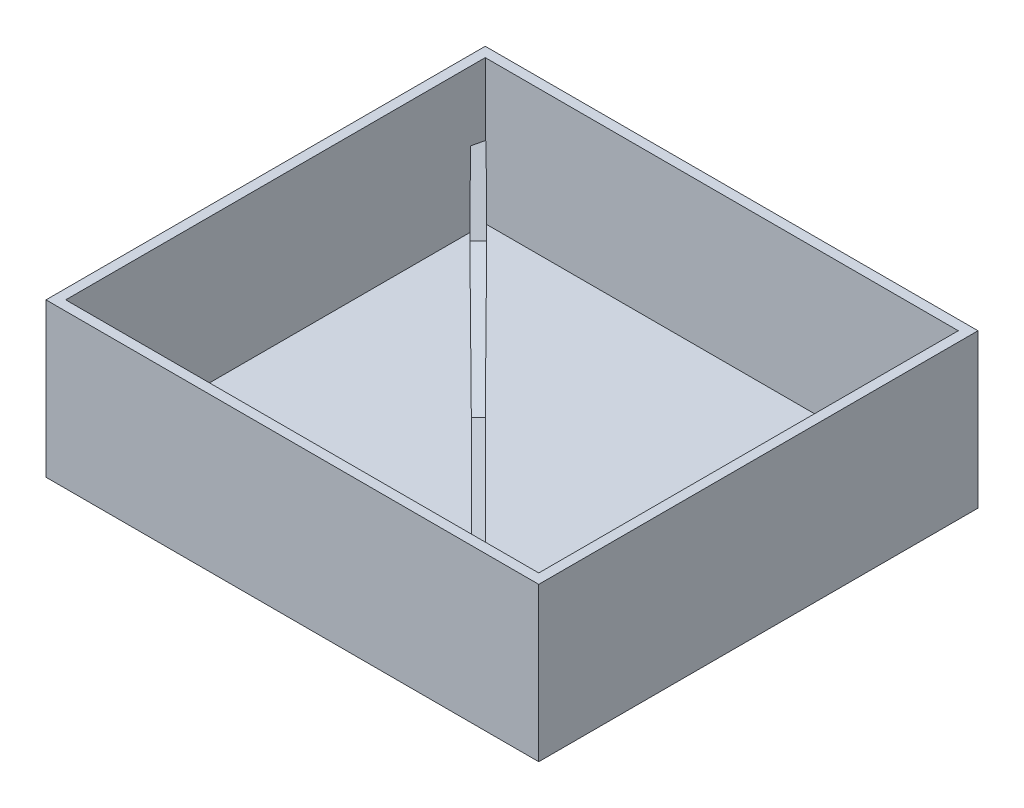
ISO-10303-21;
HEADER;
FILE_DESCRIPTION(('STEP AP214'),'2;1');
FILE_NAME('part.step','',(''),(''),'','','');
FILE_SCHEMA(('AUTOMOTIVE_DESIGN { 1 0 10303 214 1 1 1 1 }'));
ENDSEC;
DATA;
#1=APPLICATION_CONTEXT('core data for automotive mechanical design processes');
#2=APPLICATION_PROTOCOL_DEFINITION('international standard','automotive_design',2000,#1);
#3=PRODUCT_CONTEXT('',#1,'mechanical');
#4=PRODUCT('Part','Part','',(#3));
#5=PRODUCT_RELATED_PRODUCT_CATEGORY('part','',(#4));
#6=PRODUCT_DEFINITION_FORMATION('','',#4);
#7=PRODUCT_DEFINITION_CONTEXT('part definition',#1,'design');
#8=PRODUCT_DEFINITION('design','',#6,#7);
#9=PRODUCT_DEFINITION_SHAPE('','',#8);
#10=(LENGTH_UNIT() NAMED_UNIT(*) SI_UNIT(.MILLI.,.METRE.));
#11=(NAMED_UNIT(*) PLANE_ANGLE_UNIT() SI_UNIT($,.RADIAN.));
#12=(NAMED_UNIT(*) SI_UNIT($,.STERADIAN.) SOLID_ANGLE_UNIT());
#13=UNCERTAINTY_MEASURE_WITH_UNIT(LENGTH_MEASURE(1.E-05),#10,'distance_accuracy_value','');
#14=(GEOMETRIC_REPRESENTATION_CONTEXT(3) GLOBAL_UNCERTAINTY_ASSIGNED_CONTEXT((#13)) GLOBAL_UNIT_ASSIGNED_CONTEXT((#10,
#11,#12)) REPRESENTATION_CONTEXT('',''));
#15=CARTESIAN_POINT('',(0.,0.,0.));
#16=DIRECTION('',(0.,0.,1.));
#17=DIRECTION('',(1.,0.,0.));
#18=AXIS2_PLACEMENT_3D('',#15,#16,#17);
#19=CARTESIAN_POINT('',(-59.9378997860176,39.624,-63.9370439423789));
#20=DIRECTION('',(1.,0.,0.));
#21=DIRECTION('',(0.,0.,-1.));
#22=AXIS2_PLACEMENT_3D('',#19,#20,#21);
#23=PLANE('',#22);
#24=DIRECTION('',(0.,-1.,0.));
#25=VECTOR('',#24,1.);
#26=CARTESIAN_POINT('',(-59.9378997860176,39.624,-61.397043942379));
#27=LINE('',#26,#25);
#28=CARTESIAN_POINT('',(-59.9378997860176,12.5010895055775,-61.397043942379));
#29=VERTEX_POINT('',#28);
#30=CARTESIAN_POINT('',(-59.9378997860176,2.54,-61.397043942379));
#31=VERTEX_POINT('',#30);
#32=EDGE_CURVE('E209',#29,#31,#27,.T.);
#33=ORIENTED_EDGE('',*,*,#32,.F.);
#34=DIRECTION('',(0.,-0.999699679804416,0.0245061257433425));
#35=VECTOR('',#34,1.);
#36=CARTESIAN_POINT('',(-59.9378997860176,39.669938196496,-62.0630471789227));
#37=LINE('',#36,#35);
#38=CARTESIAN_POINT('',(-59.9378997860176,2.54,-61.1528628979156));
#39=VERTEX_POINT('',#38);
#40=EDGE_CURVE('E184',#29,#39,#37,.T.);
#41=ORIENTED_EDGE('',*,*,#40,.T.);
#42=DIRECTION('',(0.,0.,1.));
#43=VECTOR('',#42,1.);
#44=CARTESIAN_POINT('',(-59.9378997860176,2.54,-63.9370439423789));
#45=LINE('',#44,#43);
#46=EDGE_CURVE('E197',#31,#39,#45,.T.);
#47=ORIENTED_EDGE('',*,*,#46,.F.);
#48=EDGE_LOOP('',(#33,#41,#47));
#49=FACE_BOUND('',#48,.T.);
#50=ADVANCED_FACE('F43',(#49),#23,.T.);
#51=CARTESIAN_POINT('',(0.,2.54,0.));
#52=DIRECTION('',(0.,1.,0.));
#53=DIRECTION('',(0.,0.,1.));
#54=AXIS2_PLACEMENT_3D('',#51,#52,#53);
#55=PLANE('',#54);
#56=ORIENTED_EDGE('',*,*,#46,.T.);
#57=DIRECTION('',(0.705423945591434,0.,0.708785621317344));
#58=VECTOR('',#57,1.);
#59=CARTESIAN_POINT('',(0.464660212439838,2.54,-0.462456390988082));
#60=LINE('',#59,#58);
#61=CARTESIAN_POINT('',(47.5085328799389,2.54,46.8056023787655));
#62=VERTEX_POINT('',#61);
#63=EDGE_CURVE('E260',#39,#62,#60,.T.);
#64=ORIENTED_EDGE('',*,*,#63,.T.);
#65=DIRECTION('',(1.,0.,0.));
#66=VECTOR('',#65,1.);
#67=CARTESIAN_POINT('',(-62.4778997860176,2.54,46.8056023787655));
#68=LINE('',#67,#66);
#69=CARTESIAN_POINT('',(62.0602912861796,2.54,46.8056023787655));
#70=VERTEX_POINT('',#69);
#71=EDGE_CURVE('E200',#62,#70,#68,.T.);
#72=ORIENTED_EDGE('',*,*,#71,.T.);
#73=DIRECTION('',(0.,0.,-1.));
#74=VECTOR('',#73,1.);
#75=CARTESIAN_POINT('',(62.0602912861796,2.54,-63.9370439423789));
#76=LINE('',#75,#74);
#77=CARTESIAN_POINT('',(62.0602912861796,2.54,-61.397043942379));
#78=VERTEX_POINT('',#77);
#79=EDGE_CURVE('E214',#70,#78,#76,.T.);
#80=ORIENTED_EDGE('',*,*,#79,.T.);
#81=DIRECTION('',(-1.,0.,0.));
#82=VECTOR('',#81,1.);
#83=CARTESIAN_POINT('',(-62.4778997860176,2.54,-61.397043942379));
#84=LINE('',#83,#82);
#85=EDGE_CURVE('E217',#78,#31,#84,.T.);
#86=ORIENTED_EDGE('',*,*,#85,.T.);
#87=EDGE_LOOP('',(#56,#64,#72,#80,#86));
#88=FACE_BOUND('',#87,.T.);
#89=ADVANCED_FACE('F287',(#88),#55,.T.);
#90=CARTESIAN_POINT('',(-62.4778997860176,39.624,-63.9370439423789));
#91=DIRECTION('',(1.,0.,0.));
#92=DIRECTION('',(0.,0.,-1.));
#93=AXIS2_PLACEMENT_3D('',#90,#91,#92);
#94=PLANE('',#93);
#95=DIRECTION('',(0.,-1.,0.));
#96=VECTOR('',#95,1.);
#97=CARTESIAN_POINT('',(-62.4778997860176,39.624,-63.9370439423789));
#98=LINE('',#97,#96);
#99=CARTESIAN_POINT('',(-62.4778997860176,39.624,-63.9370439423789));
#100=VERTEX_POINT('',#99);
#101=CARTESIAN_POINT('',(-62.4778997860176,0.,-63.9370439423789));
#102=VERTEX_POINT('',#101);
#103=EDGE_CURVE('E237',#100,#102,#98,.T.);
#104=ORIENTED_EDGE('',*,*,#103,.T.);
#105=DIRECTION('',(0.,0.,1.));
#106=VECTOR('',#105,1.);
#107=CARTESIAN_POINT('',(-62.4778997860176,0.,-63.9370439423789));
#108=LINE('',#107,#106);
#109=CARTESIAN_POINT('',(-62.4778997860176,0.,49.3456023787655));
#110=VERTEX_POINT('',#109);
#111=EDGE_CURVE('E202',#102,#110,#108,.T.);
#112=ORIENTED_EDGE('',*,*,#111,.T.);
#113=DIRECTION('',(0.,-1.,0.));
#114=VECTOR('',#113,1.);
#115=CARTESIAN_POINT('',(-62.4778997860176,39.624,49.3456023787655));
#116=LINE('',#115,#114);
#117=CARTESIAN_POINT('',(-62.4778997860176,39.624,49.3456023787655));
#118=VERTEX_POINT('',#117);
#119=EDGE_CURVE('E251',#118,#110,#116,.T.);
#120=ORIENTED_EDGE('',*,*,#119,.F.);
#121=DIRECTION('',(0.,0.,1.));
#122=VECTOR('',#121,1.);
#123=CARTESIAN_POINT('',(-62.4778997860176,39.624,-63.9370439423789));
#124=LINE('',#123,#122);
#125=EDGE_CURVE('E230',#100,#118,#124,.T.);
#126=ORIENTED_EDGE('',*,*,#125,.F.);
#127=EDGE_LOOP('',(#104,#112,#120,#126));
#128=FACE_BOUND('',#127,.T.);
#129=ADVANCED_FACE('F44',(#128),#94,.F.);
#130=CARTESIAN_POINT('',(-62.4778997860176,39.624,49.3456023787655));
#131=DIRECTION('',(0.,0.,-1.));
#132=DIRECTION('',(-1.,0.,0.));
#133=AXIS2_PLACEMENT_3D('',#130,#131,#132);
#134=PLANE('',#133);
#135=DIRECTION('',(1.,0.,0.));
#136=VECTOR('',#135,1.);
#137=CARTESIAN_POINT('',(-62.4778997860176,0.,49.3456023787655));
#138=LINE('',#137,#136);
#139=CARTESIAN_POINT('',(64.6002912861796,0.,49.3456023787655));
#140=VERTEX_POINT('',#139);
#141=EDGE_CURVE('E241',#110,#140,#138,.T.);
#142=ORIENTED_EDGE('',*,*,#141,.T.);
#143=DIRECTION('',(0.,-1.,0.));
#144=VECTOR('',#143,1.);
#145=CARTESIAN_POINT('',(64.6002912861796,39.624,49.3456023787655));
#146=LINE('',#145,#144);
#147=CARTESIAN_POINT('',(64.6002912861796,39.624,49.3456023787655));
#148=VERTEX_POINT('',#147);
#149=EDGE_CURVE('E252',#148,#140,#146,.T.);
#150=ORIENTED_EDGE('',*,*,#149,.F.);
#151=DIRECTION('',(1.,0.,0.));
#152=VECTOR('',#151,1.);
#153=CARTESIAN_POINT('',(-62.4778997860176,39.624,49.3456023787655));
#154=LINE('',#153,#152);
#155=EDGE_CURVE('E235',#118,#148,#154,.T.);
#156=ORIENTED_EDGE('',*,*,#155,.F.);
#157=ORIENTED_EDGE('',*,*,#119,.T.);
#158=EDGE_LOOP('',(#142,#150,#156,#157));
#159=FACE_BOUND('',#158,.T.);
#160=ADVANCED_FACE('F321',(#159),#134,.F.);
#161=CARTESIAN_POINT('',(64.6002912861796,39.624,-63.9370439423789));
#162=DIRECTION('',(-1.,0.,0.));
#163=DIRECTION('',(0.,0.,1.));
#164=AXIS2_PLACEMENT_3D('',#161,#162,#163);
#165=PLANE('',#164);
#166=DIRECTION('',(0.,0.,-1.));
#167=VECTOR('',#166,1.);
#168=CARTESIAN_POINT('',(64.6002912861796,0.,-63.9370439423789));
#169=LINE('',#168,#167);
#170=CARTESIAN_POINT('',(64.6002912861796,0.,-63.9370439423789));
#171=VERTEX_POINT('',#170);
#172=EDGE_CURVE('E243',#140,#171,#169,.T.);
#173=ORIENTED_EDGE('',*,*,#172,.T.);
#174=DIRECTION('',(0.,-1.,0.));
#175=VECTOR('',#174,1.);
#176=CARTESIAN_POINT('',(64.6002912861796,39.624,-63.9370439423789));
#177=LINE('',#176,#175);
#178=CARTESIAN_POINT('',(64.6002912861796,39.624,-63.9370439423789));
#179=VERTEX_POINT('',#178);
#180=EDGE_CURVE('E247',#179,#171,#177,.T.);
#181=ORIENTED_EDGE('',*,*,#180,.F.);
#182=DIRECTION('',(0.,0.,-1.));
#183=VECTOR('',#182,1.);
#184=CARTESIAN_POINT('',(64.6002912861796,39.624,-63.9370439423789));
#185=LINE('',#184,#183);
#186=EDGE_CURVE('E232',#148,#179,#185,.T.);
#187=ORIENTED_EDGE('',*,*,#186,.F.);
#188=ORIENTED_EDGE('',*,*,#149,.T.);
#189=EDGE_LOOP('',(#173,#181,#187,#188));
#190=FACE_BOUND('',#189,.T.);
#191=ADVANCED_FACE('F322',(#190),#165,.F.);
#192=CARTESIAN_POINT('',(-62.4778997860176,39.624,-63.9370439423789));
#193=DIRECTION('',(0.,0.,1.));
#194=DIRECTION('',(1.,0.,0.));
#195=AXIS2_PLACEMENT_3D('',#192,#193,#194);
#196=PLANE('',#195);
#197=DIRECTION('',(-1.,0.,0.));
#198=VECTOR('',#197,1.);
#199=CARTESIAN_POINT('',(-62.4778997860176,0.,-63.9370439423789));
#200=LINE('',#199,#198);
#201=EDGE_CURVE('E231',#171,#102,#200,.T.);
#202=ORIENTED_EDGE('',*,*,#201,.T.);
#203=ORIENTED_EDGE('',*,*,#103,.F.);
#204=DIRECTION('',(-1.,0.,0.));
#205=VECTOR('',#204,1.);
#206=CARTESIAN_POINT('',(-62.4778997860176,39.624,-63.9370439423789));
#207=LINE('',#206,#205);
#208=EDGE_CURVE('E240',#179,#100,#207,.T.);
#209=ORIENTED_EDGE('',*,*,#208,.F.);
#210=ORIENTED_EDGE('',*,*,#180,.T.);
#211=EDGE_LOOP('',(#202,#203,#209,#210));
#212=FACE_BOUND('',#211,.T.);
#213=ADVANCED_FACE('F317',(#212),#196,.F.);
#214=CARTESIAN_POINT('',(0.,39.624,0.));
#215=DIRECTION('',(0.,1.,0.));
#216=DIRECTION('',(0.,0.,1.));
#217=AXIS2_PLACEMENT_3D('',#214,#215,#216);
#218=PLANE('',#217);
#219=DIRECTION('',(0.,0.,1.));
#220=VECTOR('',#219,1.);
#221=CARTESIAN_POINT('',(-59.9378997860176,39.624,-63.9370439423789));
#222=LINE('',#221,#220);
#223=CARTESIAN_POINT('',(-59.9378997860176,39.624,-61.397043942379));
#224=VERTEX_POINT('',#223);
#225=CARTESIAN_POINT('',(-59.9378997860176,39.624,46.8056023787655));
#226=VERTEX_POINT('',#225);
#227=EDGE_CURVE('E221',#224,#226,#222,.T.);
#228=ORIENTED_EDGE('',*,*,#227,.F.);
#229=DIRECTION('',(-1.,0.,0.));
#230=VECTOR('',#229,1.);
#231=CARTESIAN_POINT('',(-62.4778997860176,39.624,-61.397043942379));
#232=LINE('',#231,#230);
#233=CARTESIAN_POINT('',(62.0602912861796,39.624,-61.397043942379));
#234=VERTEX_POINT('',#233);
#235=EDGE_CURVE('E227',#234,#224,#232,.T.);
#236=ORIENTED_EDGE('',*,*,#235,.F.);
#237=DIRECTION('',(0.,0.,-1.));
#238=VECTOR('',#237,1.);
#239=CARTESIAN_POINT('',(62.0602912861796,39.624,-63.9370439423789));
#240=LINE('',#239,#238);
#241=CARTESIAN_POINT('',(62.0602912861796,39.624,46.8056023787655));
#242=VERTEX_POINT('',#241);
#243=EDGE_CURVE('E224',#242,#234,#240,.T.);
#244=ORIENTED_EDGE('',*,*,#243,.F.);
#245=DIRECTION('',(1.,0.,0.));
#246=VECTOR('',#245,1.);
#247=CARTESIAN_POINT('',(-62.4778997860176,39.624,46.8056023787655));
#248=LINE('',#247,#246);
#249=EDGE_CURVE('E223',#226,#242,#248,.T.);
#250=ORIENTED_EDGE('',*,*,#249,.F.);
#251=EDGE_LOOP('',(#228,#236,#244,#250));
#252=FACE_BOUND('',#251,.T.);
#253=ORIENTED_EDGE('',*,*,#125,.T.);
#254=ORIENTED_EDGE('',*,*,#155,.T.);
#255=ORIENTED_EDGE('',*,*,#186,.T.);
#256=ORIENTED_EDGE('',*,*,#208,.T.);
#257=EDGE_LOOP('',(#253,#254,#255,#256));
#258=FACE_BOUND('',#257,.T.);
#259=ADVANCED_FACE('F269',(#252,#258),#218,.T.);
#260=CARTESIAN_POINT('',(0.,0.,0.));
#261=DIRECTION('',(0.,1.,0.));
#262=DIRECTION('',(0.,0.,1.));
#263=AXIS2_PLACEMENT_3D('',#260,#261,#262);
#264=PLANE('',#263);
#265=ORIENTED_EDGE('',*,*,#141,.F.);
#266=ORIENTED_EDGE('',*,*,#111,.F.);
#267=ORIENTED_EDGE('',*,*,#201,.F.);
#268=ORIENTED_EDGE('',*,*,#172,.F.);
#269=EDGE_LOOP('',(#265,#266,#267,#268));
#270=FACE_BOUND('',#269,.T.);
#271=ADVANCED_FACE('F302',(#270),#264,.F.);
#272=DIRECTION('',(0.,-0.189206076258095,-0.981937401623452));
#273=VECTOR('',#272,1.);
#274=CARTESIAN_POINT('',(-59.9378997860176,21.2739437474469,-60.4012359194636));
#275=LINE('',#274,#273);
#276=CARTESIAN_POINT('',(-59.9378997860176,21.0820649897881,-61.397043942379));
#277=VERTEX_POINT('',#276);
#278=CARTESIAN_POINT('',(-59.9378997860176,21.8163644854529,-57.5861930804707));
#279=VERTEX_POINT('',#278);
#280=EDGE_CURVE('E158',#277,#279,#275,.F.);
#281=ORIENTED_EDGE('',*,*,#280,.F.);
#282=EDGE_CURVE('E207',#224,#277,#27,.T.);
#283=ORIENTED_EDGE('',*,*,#282,.F.);
#284=ORIENTED_EDGE('',*,*,#227,.T.);
#285=DIRECTION('',(0.,-1.,0.));
#286=VECTOR('',#285,1.);
#287=CARTESIAN_POINT('',(-59.9378997860176,39.624,46.8056023787655));
#288=LINE('',#287,#286);
#289=CARTESIAN_POINT('',(-59.9378997860176,2.54,46.8056023787655));
#290=VERTEX_POINT('',#289);
#291=EDGE_CURVE('E201',#226,#290,#288,.T.);
#292=ORIENTED_EDGE('',*,*,#291,.T.);
#293=CARTESIAN_POINT('',(-59.9378997860176,2.54,-58.0564828518241));
#294=VERTEX_POINT('',#293);
#295=EDGE_CURVE('E196',#294,#290,#45,.T.);
#296=ORIENTED_EDGE('',*,*,#295,.F.);
#297=DIRECTION('',(0.,-0.999702520538063,-0.0243899657614447));
#298=VECTOR('',#297,1.);
#299=CARTESIAN_POINT('',(-59.9378997860176,39.4585558078156,-57.1557725969075));
#300=LINE('',#299,#298);
#301=EDGE_CURVE('E194',#279,#294,#300,.T.);
#302=ORIENTED_EDGE('',*,*,#301,.F.);
#303=EDGE_LOOP('',(#281,#283,#284,#292,#296,#302));
#304=FACE_BOUND('',#303,.T.);
#305=ADVANCED_FACE('F264',(#304),#23,.T.);
#306=CARTESIAN_POINT('',(-62.4778997860176,39.624,46.8056023787655));
#307=DIRECTION('',(0.,0.,-1.));
#308=DIRECTION('',(-1.,0.,0.));
#309=AXIS2_PLACEMENT_3D('',#306,#307,#308);
#310=PLANE('',#309);
#311=DIRECTION('',(-0.0245061257433425,0.999699679804416,0.));
#312=VECTOR('',#311,1.);
#313=CARTESIAN_POINT('',(44.4505897391954,42.2451902062059,46.8056023787655));
#314=LINE('',#313,#312);
#315=CARTESIAN_POINT('',(45.4239024285093,2.54,46.8056023787655));
#316=VERTEX_POINT('',#315);
#317=CARTESIAN_POINT('',(44.6726440866992,33.1867342746714,46.8056023787655));
#318=VERTEX_POINT('',#317);
#319=EDGE_CURVE('E192',#316,#318,#314,.T.);
#320=ORIENTED_EDGE('',*,*,#319,.F.);
#321=EDGE_CURVE('E208',#290,#316,#68,.T.);
#322=ORIENTED_EDGE('',*,*,#321,.F.);
#323=ORIENTED_EDGE('',*,*,#291,.F.);
#324=ORIENTED_EDGE('',*,*,#249,.T.);
#325=DIRECTION('',(0.,-1.,0.));
#326=VECTOR('',#325,1.);
#327=CARTESIAN_POINT('',(62.0602912861796,39.624,46.8056023787655));
#328=LINE('',#327,#326);
#329=EDGE_CURVE('E204',#242,#70,#328,.T.);
#330=ORIENTED_EDGE('',*,*,#329,.T.);
#331=ORIENTED_EDGE('',*,*,#71,.F.);
#332=DIRECTION('',(0.0243899657614447,0.999702520538063,0.));
#333=VECTOR('',#332,1.);
#334=CARTESIAN_POINT('',(48.3473136302821,36.9201725061236,46.8056023787655));
#335=LINE('',#334,#333);
#336=CARTESIAN_POINT('',(48.2647465351269,33.5358900537595,46.8056023787655));
#337=VERTEX_POINT('',#336);
#338=EDGE_CURVE('E59',#62,#337,#335,.T.);
#339=ORIENTED_EDGE('',*,*,#338,.T.);
#340=DIRECTION('',(-0.995309200473239,-0.0967450022136603,0.));
#341=VECTOR('',#340,1.);
#342=CARTESIAN_POINT('',(-60.855162060558,22.9293310129866,46.8056023787655));
#343=LINE('',#342,#341);
#344=EDGE_CURVE('E11',#318,#337,#343,.F.);
#345=ORIENTED_EDGE('',*,*,#344,.F.);
#346=EDGE_LOOP('',(#320,#322,#323,#324,#330,#331,#339,#345));
#347=FACE_BOUND('',#346,.T.);
#348=ADVANCED_FACE('F280',(#347),#310,.T.);
#349=CARTESIAN_POINT('',(62.0602912861796,39.624,-63.9370439423789));
#350=DIRECTION('',(-1.,0.,0.));
#351=DIRECTION('',(0.,0.,1.));
#352=AXIS2_PLACEMENT_3D('',#349,#350,#351);
#353=PLANE('',#352);
#354=ORIENTED_EDGE('',*,*,#79,.F.);
#355=ORIENTED_EDGE('',*,*,#329,.F.);
#356=ORIENTED_EDGE('',*,*,#243,.T.);
#357=DIRECTION('',(0.,-1.,0.));
#358=VECTOR('',#357,1.);
#359=CARTESIAN_POINT('',(62.0602912861796,39.624,-61.397043942379));
#360=LINE('',#359,#358);
#361=EDGE_CURVE('E66',#234,#78,#360,.T.);
#362=ORIENTED_EDGE('',*,*,#361,.T.);
#363=EDGE_LOOP('',(#354,#355,#356,#362));
#364=FACE_BOUND('',#363,.T.);
#365=ADVANCED_FACE('F307',(#364),#353,.T.);
#366=CARTESIAN_POINT('',(-62.4778997860176,39.624,-61.397043942379));
#367=DIRECTION('',(0.,0.,1.));
#368=DIRECTION('',(1.,0.,0.));
#369=AXIS2_PLACEMENT_3D('',#366,#367,#368);
#370=PLANE('',#369);
#371=DIRECTION('',(0.981937401623452,0.189206076258095,0.));
#372=VECTOR('',#371,1.);
#373=CARTESIAN_POINT('',(-58.9420917631022,21.2739437474469,-61.397043942379));
#374=LINE('',#373,#372);
#375=CARTESIAN_POINT('',(-59.7275589945295,21.1225948196619,-61.397043942379));
#376=VERTEX_POINT('',#375);
#377=EDGE_CURVE('E51',#376,#277,#374,.F.);
#378=ORIENTED_EDGE('',*,*,#377,.F.);
#379=DIRECTION('',(-0.0243899657614447,-0.999702520538063,0.));
#380=VECTOR('',#379,1.);
#381=CARTESIAN_POINT('',(-59.2780806892536,39.5459332985468,-61.397043942379));
#382=LINE('',#381,#380);
#383=EDGE_CURVE('E189',#376,#29,#382,.T.);
#384=ORIENTED_EDGE('',*,*,#383,.T.);
#385=ORIENTED_EDGE('',*,*,#32,.T.);
#386=ORIENTED_EDGE('',*,*,#85,.F.);
#387=ORIENTED_EDGE('',*,*,#361,.F.);
#388=ORIENTED_EDGE('',*,*,#235,.T.);
#389=ORIENTED_EDGE('',*,*,#282,.T.);
#390=EDGE_LOOP('',(#378,#384,#385,#386,#387,#388,#389));
#391=FACE_BOUND('',#390,.T.);
#392=ADVANCED_FACE('F266',(#391),#370,.T.);
#393=DIRECTION('',(0.708785621317344,0.,0.705423945591434));
#394=VECTOR('',#393,1.);
#395=CARTESIAN_POINT('',(-0.798560707870797,2.54,0.80236622392124));
#396=LINE('',#395,#394);
#397=EDGE_CURVE('E256',#294,#316,#396,.T.);
#398=ORIENTED_EDGE('',*,*,#397,.F.);
#399=ORIENTED_EDGE('',*,*,#295,.T.);
#400=ORIENTED_EDGE('',*,*,#321,.T.);
#401=EDGE_LOOP('',(#398,#399,#400));
#402=FACE_BOUND('',#401,.T.);
#403=ADVANCED_FACE('F282',(#402),#55,.T.);
#404=CARTESIAN_POINT('',(6.19267906962794,25.357,4.73353491326659));
#405=DIRECTION('',(0.0962954087319371,-0.990683798451503,0.0962954087319371));
#406=DIRECTION('',(0.700519231896705,0.136182273022966,0.700519231896705));
#407=AXIS2_PLACEMENT_3D('',#404,#405,#406);
#408=PLANE('',#407);
#409=DIRECTION('',(-0.700519231896705,-0.136182273022966,-0.700519231896705));
#410=VECTOR('',#409,1.);
#411=CARTESIAN_POINT('',(4.39662784541411,25.357,6.52958613748042));
#412=LINE('',#411,#410);
#413=CARTESIAN_POINT('',(4.39662784541411,25.357,6.52958613748042));
#414=VERTEX_POINT('',#413);
#415=EDGE_CURVE('E172',#414,#318,#412,.F.);
#416=ORIENTED_EDGE('',*,*,#415,.T.);
#417=ORIENTED_EDGE('',*,*,#344,.T.);
#418=DIRECTION('',(0.700519231896705,0.136182273022966,0.700519231896705));
#419=VECTOR('',#418,1.);
#420=CARTESIAN_POINT('',(7.38652136498164,25.589085216236,5.92737720862029));
#421=LINE('',#420,#419);
#422=CARTESIAN_POINT('',(6.19267906962794,25.357,4.73353491326659));
#423=VERTEX_POINT('',#422);
#424=EDGE_CURVE('E179',#423,#337,#421,.T.);
#425=ORIENTED_EDGE('',*,*,#424,.F.);
#426=DIRECTION('',(-0.707106781186547,0.,0.707106781186548));
#427=VECTOR('',#426,1.);
#428=CARTESIAN_POINT('',(6.19267906962794,25.357,4.73353491326659));
#429=LINE('',#428,#427);
#430=EDGE_CURVE('E169',#423,#414,#429,.T.);
#431=ORIENTED_EDGE('',*,*,#430,.T.);
#432=EDGE_LOOP('',(#416,#417,#425,#431));
#433=FACE_BOUND('',#432,.T.);
#434=ADVANCED_FACE('F283',(#433),#408,.F.);
#435=CARTESIAN_POINT('',(-23.4746930418348,35.134,-24.9338371981962));
#436=DIRECTION('',(-0.160477384938449,-0.973906575522844,-0.160477384938449));
#437=DIRECTION('',(0.688655943794372,-0.226949294234123,0.688655943794372));
#438=AXIS2_PLACEMENT_3D('',#435,#436,#437);
#439=PLANE('',#438);
#440=ORIENTED_EDGE('',*,*,#430,.F.);
#441=DIRECTION('',(0.684230593849082,-0.226944876564509,0.693054483747168));
#442=VECTOR('',#441,1.);
#443=CARTESIAN_POINT('',(7.28169406994459,24.9957966614684,5.83659393404438));
#444=LINE('',#443,#442);
#445=CARTESIAN_POINT('',(-23.2846222791907,35.134,-25.1239079608403));
#446=VERTEX_POINT('',#445);
#447=EDGE_CURVE('E166',#446,#423,#444,.T.);
#448=ORIENTED_EDGE('',*,*,#447,.F.);
#449=DIRECTION('',(-0.707106781186547,0.,0.707106781186548));
#450=VECTOR('',#449,1.);
#451=CARTESIAN_POINT('',(-23.4746930418348,35.134,-24.9338371981962));
#452=LINE('',#451,#450);
#453=CARTESIAN_POINT('',(-25.4608150286928,35.134,-22.9477152113382));
#454=VERTEX_POINT('',#453);
#455=EDGE_CURVE('E155',#446,#454,#452,.T.);
#456=ORIENTED_EDGE('',*,*,#455,.T.);
#457=DIRECTION('',(-0.693054483747168,0.226944876564509,-0.684230593849082));
#458=VECTOR('',#457,1.);
#459=CARTESIAN_POINT('',(-25.4486690258844,35.1300227180218,-22.9357238500393));
#460=LINE('',#459,#458);
#461=EDGE_CURVE('E162',#454,#414,#460,.F.);
#462=ORIENTED_EDGE('',*,*,#461,.T.);
#463=EDGE_LOOP('',(#440,#448,#456,#462));
#464=FACE_BOUND('',#463,.T.);
#465=ADVANCED_FACE('F168',(#464),#439,.F.);
#466=CARTESIAN_POINT('',(-59.9380684272816,21.082,-61.3972125836429));
#467=DIRECTION('',(0.185907687388523,-0.96481949790606,0.185907687388523));
#468=DIRECTION('',(0.682230409590376,0.262913172854267,0.682230409590375));
#469=AXIS2_PLACEMENT_3D('',#466,#467,#468);
#470=PLANE('',#469);
#471=ORIENTED_EDGE('',*,*,#377,.T.);
#472=ORIENTED_EDGE('',*,*,#280,.T.);
#473=DIRECTION('',(-0.680635592515083,-0.262912505600344,-0.683821763766401));
#474=VECTOR('',#473,1.);
#475=CARTESIAN_POINT('',(-61.8431665647337,21.0804075826139,-59.5003787378102));
#476=LINE('',#475,#474);
#477=EDGE_CURVE('E151',#279,#454,#476,.F.);
#478=ORIENTED_EDGE('',*,*,#477,.T.);
#479=ORIENTED_EDGE('',*,*,#455,.F.);
#480=DIRECTION('',(0.683821763766401,0.262912505600344,0.680635592515083));
#481=VECTOR('',#480,1.);
#482=CARTESIAN_POINT('',(3.7938497184302,45.5450007869759,1.8283957081605));
#483=LINE('',#482,#481);
#484=EDGE_CURVE('E176',#376,#446,#483,.T.);
#485=ORIENTED_EDGE('',*,*,#484,.F.);
#486=EDGE_LOOP('',(#471,#472,#478,#479,#485));
#487=FACE_BOUND('',#486,.T.);
#488=ADVANCED_FACE('F154',(#487),#470,.F.);
#489=CARTESIAN_POINT('',(5.59047014076781,25.589085216236,7.72342843283412));
#490=DIRECTION('',(-0.70531849878759,-0.0172898163014075,0.708679672010058));
#491=DIRECTION('',(0.708785621317344,0.,0.705423945591434));
#492=AXIS2_PLACEMENT_3D('',#489,#490,#491);
#493=PLANE('',#492);
#494=ORIENTED_EDGE('',*,*,#477,.F.);
#495=ORIENTED_EDGE('',*,*,#301,.T.);
#496=ORIENTED_EDGE('',*,*,#397,.T.);
#497=ORIENTED_EDGE('',*,*,#319,.T.);
#498=ORIENTED_EDGE('',*,*,#415,.F.);
#499=ORIENTED_EDGE('',*,*,#461,.F.);
#500=EDGE_LOOP('',(#494,#495,#496,#497,#498,#499));
#501=FACE_BOUND('',#500,.T.);
#502=ADVANCED_FACE('F175',(#501),#493,.T.);
#503=CARTESIAN_POINT('',(7.38652136498164,25.589085216236,5.92737720862029));
#504=DIRECTION('',(-0.708679672010058,0.0172898163014075,0.70531849878759));
#505=DIRECTION('',(0.705423945591434,0.,0.708785621317344));
#506=AXIS2_PLACEMENT_3D('',#503,#504,#505);
#507=PLANE('',#506);
#508=ORIENTED_EDGE('',*,*,#383,.F.);
#509=ORIENTED_EDGE('',*,*,#484,.T.);
#510=ORIENTED_EDGE('',*,*,#447,.T.);
#511=ORIENTED_EDGE('',*,*,#424,.T.);
#512=ORIENTED_EDGE('',*,*,#338,.F.);
#513=ORIENTED_EDGE('',*,*,#63,.F.);
#514=ORIENTED_EDGE('',*,*,#40,.F.);
#515=EDGE_LOOP('',(#508,#509,#510,#511,#512,#513,#514));
#516=FACE_BOUND('',#515,.T.);
#517=ADVANCED_FACE('F293',(#516),#507,.F.);
#518=CLOSED_SHELL('',(#50,#89,#129,#160,#191,#213,#259,#271,#305,#348,#365,#392,#403,#434,#465,
#488,#502,#517));
#519=MANIFOLD_SOLID_BREP('B2',#518);
#520=ADVANCED_BREP_SHAPE_REPRESENTATION('',(#18,#519),#14);
#521=SHAPE_DEFINITION_REPRESENTATION(#9,#520);
ENDSEC;
END-ISO-10303-21;
